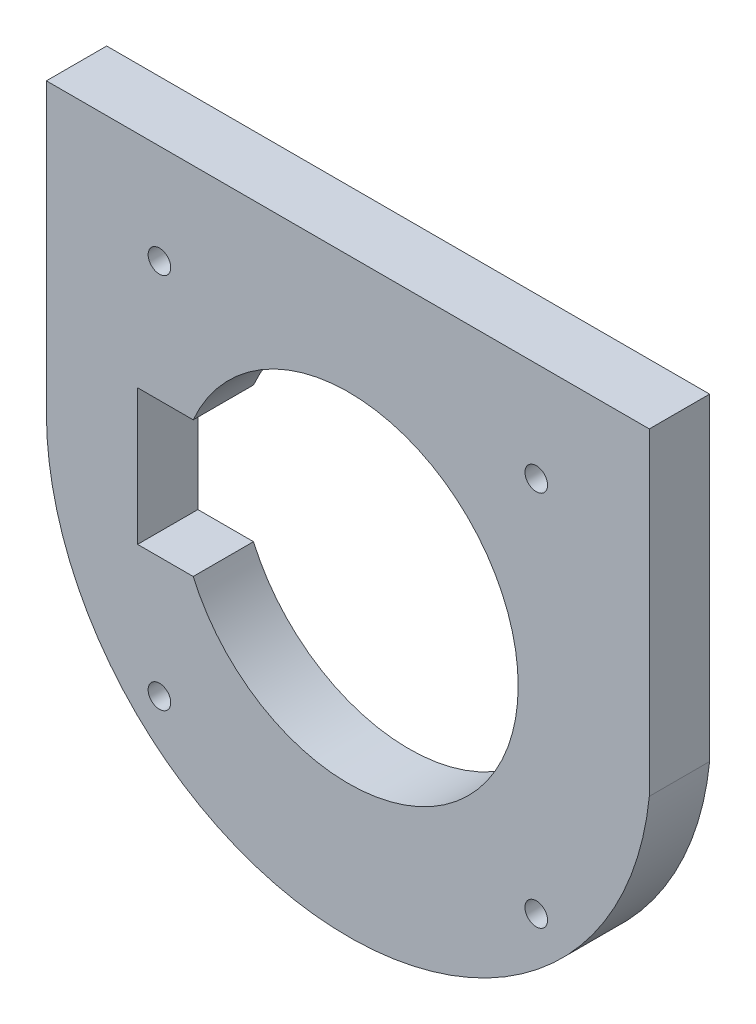
ISO-10303-21;
HEADER;
FILE_DESCRIPTION(('STEP AP214'),'2;1');
FILE_NAME('part.step','',(''),(''),'','','');
FILE_SCHEMA(('AUTOMOTIVE_DESIGN { 1 0 10303 214 1 1 1 1 }'));
ENDSEC;
DATA;
#1=APPLICATION_CONTEXT('core data for automotive mechanical design processes');
#2=APPLICATION_PROTOCOL_DEFINITION('international standard','automotive_design',2000,#1);
#3=PRODUCT_CONTEXT('',#1,'mechanical');
#4=PRODUCT('Part','Part','',(#3));
#5=PRODUCT_RELATED_PRODUCT_CATEGORY('part','',(#4));
#6=PRODUCT_DEFINITION_FORMATION('','',#4);
#7=PRODUCT_DEFINITION_CONTEXT('part definition',#1,'design');
#8=PRODUCT_DEFINITION('design','',#6,#7);
#9=PRODUCT_DEFINITION_SHAPE('','',#8);
#10=(LENGTH_UNIT() NAMED_UNIT(*) SI_UNIT(.MILLI.,.METRE.));
#11=(NAMED_UNIT(*) PLANE_ANGLE_UNIT() SI_UNIT($,.RADIAN.));
#12=(NAMED_UNIT(*) SI_UNIT($,.STERADIAN.) SOLID_ANGLE_UNIT());
#13=UNCERTAINTY_MEASURE_WITH_UNIT(LENGTH_MEASURE(1.E-05),#10,'distance_accuracy_value','');
#14=(GEOMETRIC_REPRESENTATION_CONTEXT(3) GLOBAL_UNCERTAINTY_ASSIGNED_CONTEXT((#13)) GLOBAL_UNIT_ASSIGNED_CONTEXT((#10,
#11,#12)) REPRESENTATION_CONTEXT('',''));
#15=CARTESIAN_POINT('',(0.,0.,0.));
#16=DIRECTION('',(0.,0.,1.));
#17=DIRECTION('',(1.,0.,0.));
#18=AXIS2_PLACEMENT_3D('',#15,#16,#17);
#19=CARTESIAN_POINT('',(0.,0.,0.));
#20=DIRECTION('',(0.,0.,-1.));
#21=DIRECTION('',(-1.,0.,0.));
#22=AXIS2_PLACEMENT_3D('',#19,#20,#21);
#23=PLANE('',#22);
#24=CARTESIAN_POINT('',(50.1000000000108,59.2999999999969,0.));
#25=DIRECTION('',(0.,0.,1.));
#26=DIRECTION('',(1.,0.,0.));
#27=AXIS2_PLACEMENT_3D('',#24,#25,#26);
#28=CIRCLE('',#27,22.5);
#29=CARTESIAN_POINT('',(29.4784093727096,50.2999999999969,0.));
#30=VERTEX_POINT('',#29);
#31=CARTESIAN_POINT('',(29.4784093727096,68.2999999999969,0.));
#32=VERTEX_POINT('',#31);
#33=EDGE_CURVE('E102',#30,#32,#28,.T.);
#34=ORIENTED_EDGE('',*,*,#33,.T.);
#35=DIRECTION('',(-1.,0.,0.));
#36=VECTOR('',#35,1.);
#37=CARTESIAN_POINT('',(29.4784093727096,68.2999999999969,0.));
#38=LINE('',#37,#36);
#39=CARTESIAN_POINT('',(22.1000000000108,68.2999999999969,0.));
#40=VERTEX_POINT('',#39);
#41=EDGE_CURVE('E111',#32,#40,#38,.T.);
#42=ORIENTED_EDGE('',*,*,#41,.T.);
#43=DIRECTION('',(0.,-1.,0.));
#44=VECTOR('',#43,1.);
#45=CARTESIAN_POINT('',(22.1000000000108,68.2999999999969,0.));
#46=LINE('',#45,#44);
#47=CARTESIAN_POINT('',(22.1000000000108,50.2999999999969,0.));
#48=VERTEX_POINT('',#47);
#49=EDGE_CURVE('E51',#40,#48,#46,.T.);
#50=ORIENTED_EDGE('',*,*,#49,.T.);
#51=DIRECTION('',(1.,0.,0.));
#52=VECTOR('',#51,1.);
#53=CARTESIAN_POINT('',(29.4784093727096,50.2999999999969,0.));
#54=LINE('',#53,#52);
#55=EDGE_CURVE('E108',#48,#30,#54,.T.);
#56=ORIENTED_EDGE('',*,*,#55,.T.);
#57=EDGE_LOOP('',(#34,#42,#50,#56));
#58=FACE_BOUND('',#57,.T.);
#59=CARTESIAN_POINT('',(25.0000000000108,84.299999999997,0.));
#60=DIRECTION('',(0.,0.,1.));
#61=DIRECTION('',(-1.,0.,0.));
#62=AXIS2_PLACEMENT_3D('',#59,#60,#61);
#63=CIRCLE('',#62,1.5);
#64=CARTESIAN_POINT('',(23.5000000000108,84.299999999997,0.));
#65=VERTEX_POINT('',#64);
#66=EDGE_CURVE('E136',#65,#65,#63,.T.);
#67=ORIENTED_EDGE('',*,*,#66,.T.);
#68=EDGE_LOOP('',(#67));
#69=FACE_BOUND('',#68,.T.);
#70=CARTESIAN_POINT('',(25.0000000000108,34.2999999999969,0.));
#71=DIRECTION('',(0.,0.,1.));
#72=DIRECTION('',(1.,0.,0.));
#73=AXIS2_PLACEMENT_3D('',#70,#71,#72);
#74=CIRCLE('',#73,1.5);
#75=CARTESIAN_POINT('',(26.5000000000108,34.2999999999969,0.));
#76=VERTEX_POINT('',#75);
#77=EDGE_CURVE('E142',#76,#76,#74,.T.);
#78=ORIENTED_EDGE('',*,*,#77,.T.);
#79=EDGE_LOOP('',(#78));
#80=FACE_BOUND('',#79,.T.);
#81=CARTESIAN_POINT('',(75.0000000000108,34.2999999999969,0.));
#82=DIRECTION('',(0.,0.,1.));
#83=DIRECTION('',(-1.,0.,0.));
#84=AXIS2_PLACEMENT_3D('',#81,#82,#83);
#85=CIRCLE('',#84,1.5);
#86=CARTESIAN_POINT('',(73.5000000000108,34.2999999999969,0.));
#87=VERTEX_POINT('',#86);
#88=EDGE_CURVE('E148',#87,#87,#85,.T.);
#89=ORIENTED_EDGE('',*,*,#88,.T.);
#90=EDGE_LOOP('',(#89));
#91=FACE_BOUND('',#90,.T.);
#92=CARTESIAN_POINT('',(75.0000000000108,84.299999999997,0.));
#93=DIRECTION('',(0.,0.,1.));
#94=DIRECTION('',(1.,0.,0.));
#95=AXIS2_PLACEMENT_3D('',#92,#93,#94);
#96=CIRCLE('',#95,1.5);
#97=CARTESIAN_POINT('',(76.5000000000108,84.299999999997,0.));
#98=VERTEX_POINT('',#97);
#99=EDGE_CURVE('E154',#98,#98,#96,.T.);
#100=ORIENTED_EDGE('',*,*,#99,.T.);
#101=EDGE_LOOP('',(#100));
#102=FACE_BOUND('',#101,.T.);
#103=DIRECTION('',(0.,-1.,0.));
#104=VECTOR('',#103,1.);
#105=CARTESIAN_POINT('',(10.0000000000108,59.2999999999969,0.));
#106=LINE('',#105,#104);
#107=CARTESIAN_POINT('',(10.0000000000108,97.5175721394297,0.));
#108=VERTEX_POINT('',#107);
#109=CARTESIAN_POINT('',(10.0000000000108,59.299999999997,0.));
#110=VERTEX_POINT('',#109);
#111=EDGE_CURVE('E162',#108,#110,#106,.T.);
#112=ORIENTED_EDGE('',*,*,#111,.F.);
#113=DIRECTION('',(-1.,0.,0.));
#114=VECTOR('',#113,1.);
#115=CARTESIAN_POINT('',(10.0000000000108,97.5175721394297,0.));
#116=LINE('',#115,#114);
#117=CARTESIAN_POINT('',(90.0000000000108,97.5175721394297,0.));
#118=VERTEX_POINT('',#117);
#119=EDGE_CURVE('E160',#118,#108,#116,.T.);
#120=ORIENTED_EDGE('',*,*,#119,.F.);
#121=DIRECTION('',(0.,1.,0.));
#122=VECTOR('',#121,1.);
#123=CARTESIAN_POINT('',(90.0000000000108,97.5175721394297,0.));
#124=LINE('',#123,#122);
#125=CARTESIAN_POINT('',(90.0000000000108,55.2999999999969,0.));
#126=VERTEX_POINT('',#125);
#127=EDGE_CURVE('E169',#126,#118,#124,.T.);
#128=ORIENTED_EDGE('',*,*,#127,.F.);
#129=CARTESIAN_POINT('',(50.1000000000108,59.2999999999969,0.));
#130=DIRECTION('',(0.,0.,1.));
#131=DIRECTION('',(1.,0.,0.));
#132=AXIS2_PLACEMENT_3D('',#129,#130,#131);
#133=CIRCLE('',#132,40.1);
#134=EDGE_CURVE('E166',#110,#126,#133,.T.);
#135=ORIENTED_EDGE('',*,*,#134,.F.);
#136=EDGE_LOOP('',(#112,#120,#128,#135));
#137=FACE_BOUND('',#136,.T.);
#138=ADVANCED_FACE('F35',(#58,#69,#80,#91,#102,#137),#23,.T.);
#139=CARTESIAN_POINT('',(10.0000000000108,97.5175721394297,0.));
#140=DIRECTION('',(0.,1.,0.));
#141=DIRECTION('',(-1.,0.,0.));
#142=AXIS2_PLACEMENT_3D('',#139,#140,#141);
#143=PLANE('',#142);
#144=DIRECTION('',(-1.,0.,0.));
#145=VECTOR('',#144,1.);
#146=CARTESIAN_POINT('',(10.0000000000108,97.5175721394297,8.));
#147=LINE('',#146,#145);
#148=CARTESIAN_POINT('',(90.0000000000108,97.5175721394297,8.));
#149=VERTEX_POINT('',#148);
#150=CARTESIAN_POINT('',(10.0000000000108,97.5175721394297,8.));
#151=VERTEX_POINT('',#150);
#152=EDGE_CURVE('E157',#149,#151,#147,.T.);
#153=ORIENTED_EDGE('',*,*,#152,.F.);
#154=DIRECTION('',(0.,0.,1.));
#155=VECTOR('',#154,1.);
#156=CARTESIAN_POINT('',(90.0000000000108,97.5175721394297,0.));
#157=LINE('',#156,#155);
#158=EDGE_CURVE('E12',#118,#149,#157,.T.);
#159=ORIENTED_EDGE('',*,*,#158,.F.);
#160=ORIENTED_EDGE('',*,*,#119,.T.);
#161=DIRECTION('',(0.,0.,1.));
#162=VECTOR('',#161,1.);
#163=CARTESIAN_POINT('',(10.0000000000108,97.5175721394297,0.));
#164=LINE('',#163,#162);
#165=EDGE_CURVE('E38',#108,#151,#164,.T.);
#166=ORIENTED_EDGE('',*,*,#165,.T.);
#167=EDGE_LOOP('',(#153,#159,#160,#166));
#168=FACE_BOUND('',#167,.T.);
#169=ADVANCED_FACE('F189',(#168),#143,.T.);
#170=CARTESIAN_POINT('',(90.0000000000108,97.5175721394297,0.));
#171=DIRECTION('',(1.,0.,0.));
#172=DIRECTION('',(0.,0.,-1.));
#173=AXIS2_PLACEMENT_3D('',#170,#171,#172);
#174=PLANE('',#173);
#175=DIRECTION('',(0.,1.,0.));
#176=VECTOR('',#175,1.);
#177=CARTESIAN_POINT('',(90.0000000000108,97.5175721394297,8.));
#178=LINE('',#177,#176);
#179=CARTESIAN_POINT('',(90.0000000000108,55.2999999999969,8.));
#180=VERTEX_POINT('',#179);
#181=EDGE_CURVE('E163',#180,#149,#178,.T.);
#182=ORIENTED_EDGE('',*,*,#181,.F.);
#183=DIRECTION('',(0.,0.,1.));
#184=VECTOR('',#183,1.);
#185=CARTESIAN_POINT('',(90.0000000000108,55.2999999999969,0.));
#186=LINE('',#185,#184);
#187=EDGE_CURVE('E43',#126,#180,#186,.T.);
#188=ORIENTED_EDGE('',*,*,#187,.F.);
#189=ORIENTED_EDGE('',*,*,#127,.T.);
#190=ORIENTED_EDGE('',*,*,#158,.T.);
#191=EDGE_LOOP('',(#182,#188,#189,#190));
#192=FACE_BOUND('',#191,.T.);
#193=ADVANCED_FACE('F197',(#192),#174,.T.);
#194=CARTESIAN_POINT('',(50.1000000000108,59.2999999999969,0.));
#195=DIRECTION('',(0.,0.,1.));
#196=DIRECTION('',(1.,0.,0.));
#197=AXIS2_PLACEMENT_3D('',#194,#195,#196);
#198=CYLINDRICAL_SURFACE('',#197,40.1);
#199=CARTESIAN_POINT('',(50.1000000000108,59.2999999999969,8.));
#200=DIRECTION('',(0.,0.,1.));
#201=DIRECTION('',(1.,0.,0.));
#202=AXIS2_PLACEMENT_3D('',#199,#200,#201);
#203=CIRCLE('',#202,40.1);
#204=CARTESIAN_POINT('',(10.0000000000108,59.299999999997,8.));
#205=VERTEX_POINT('',#204);
#206=EDGE_CURVE('E177',#205,#180,#203,.T.);
#207=ORIENTED_EDGE('',*,*,#206,.F.);
#208=DIRECTION('',(0.,0.,1.));
#209=VECTOR('',#208,1.);
#210=CARTESIAN_POINT('',(10.0000000000108,59.299999999997,0.));
#211=LINE('',#210,#209);
#212=EDGE_CURVE('E182',#110,#205,#211,.T.);
#213=ORIENTED_EDGE('',*,*,#212,.F.);
#214=ORIENTED_EDGE('',*,*,#134,.T.);
#215=ORIENTED_EDGE('',*,*,#187,.T.);
#216=EDGE_LOOP('',(#207,#213,#214,#215));
#217=FACE_BOUND('',#216,.T.);
#218=ADVANCED_FACE('F202',(#217),#198,.T.);
#219=CARTESIAN_POINT('',(10.0000000000108,59.2999999999969,0.));
#220=DIRECTION('',(-1.,0.,0.));
#221=DIRECTION('',(0.,-1.,0.));
#222=AXIS2_PLACEMENT_3D('',#219,#220,#221);
#223=PLANE('',#222);
#224=DIRECTION('',(0.,-1.,0.));
#225=VECTOR('',#224,1.);
#226=CARTESIAN_POINT('',(10.0000000000108,59.2999999999969,8.));
#227=LINE('',#226,#225);
#228=EDGE_CURVE('E174',#151,#205,#227,.T.);
#229=ORIENTED_EDGE('',*,*,#228,.F.);
#230=ORIENTED_EDGE('',*,*,#165,.F.);
#231=ORIENTED_EDGE('',*,*,#111,.T.);
#232=ORIENTED_EDGE('',*,*,#212,.T.);
#233=EDGE_LOOP('',(#229,#230,#231,#232));
#234=FACE_BOUND('',#233,.T.);
#235=ADVANCED_FACE('F192',(#234),#223,.T.);
#236=CARTESIAN_POINT('',(0.,0.,8.));
#237=DIRECTION('',(0.,0.,-1.));
#238=DIRECTION('',(-1.,0.,0.));
#239=AXIS2_PLACEMENT_3D('',#236,#237,#238);
#240=PLANE('',#239);
#241=DIRECTION('',(-1.,0.,0.));
#242=VECTOR('',#241,1.);
#243=CARTESIAN_POINT('',(29.4784093727096,68.2999999999969,8.));
#244=LINE('',#243,#242);
#245=CARTESIAN_POINT('',(29.4784093727096,68.2999999999969,8.));
#246=VERTEX_POINT('',#245);
#247=CARTESIAN_POINT('',(22.1000000000108,68.2999999999969,8.));
#248=VERTEX_POINT('',#247);
#249=EDGE_CURVE('E126',#246,#248,#244,.T.);
#250=ORIENTED_EDGE('',*,*,#249,.F.);
#251=CARTESIAN_POINT('',(50.1000000000108,59.2999999999969,8.));
#252=DIRECTION('',(0.,0.,1.));
#253=DIRECTION('',(1.,0.,0.));
#254=AXIS2_PLACEMENT_3D('',#251,#252,#253);
#255=CIRCLE('',#254,22.5);
#256=CARTESIAN_POINT('',(29.4784093727096,50.2999999999969,8.));
#257=VERTEX_POINT('',#256);
#258=EDGE_CURVE('E59',#257,#246,#255,.T.);
#259=ORIENTED_EDGE('',*,*,#258,.F.);
#260=DIRECTION('',(1.,0.,0.));
#261=VECTOR('',#260,1.);
#262=CARTESIAN_POINT('',(29.4784093727096,50.2999999999969,8.));
#263=LINE('',#262,#261);
#264=CARTESIAN_POINT('',(22.1000000000108,50.2999999999969,8.));
#265=VERTEX_POINT('',#264);
#266=EDGE_CURVE('E117',#265,#257,#263,.T.);
#267=ORIENTED_EDGE('',*,*,#266,.F.);
#268=DIRECTION('',(0.,-1.,0.));
#269=VECTOR('',#268,1.);
#270=CARTESIAN_POINT('',(22.1000000000108,68.2999999999969,8.));
#271=LINE('',#270,#269);
#272=EDGE_CURVE('E120',#248,#265,#271,.T.);
#273=ORIENTED_EDGE('',*,*,#272,.F.);
#274=EDGE_LOOP('',(#250,#259,#267,#273));
#275=FACE_BOUND('',#274,.T.);
#276=CARTESIAN_POINT('',(25.0000000000108,84.299999999997,8.));
#277=DIRECTION('',(0.,0.,1.));
#278=DIRECTION('',(-1.,0.,0.));
#279=AXIS2_PLACEMENT_3D('',#276,#277,#278);
#280=CIRCLE('',#279,1.5);
#281=CARTESIAN_POINT('',(23.5000000000108,84.299999999997,8.));
#282=VERTEX_POINT('',#281);
#283=EDGE_CURVE('E132',#282,#282,#280,.T.);
#284=ORIENTED_EDGE('',*,*,#283,.F.);
#285=EDGE_LOOP('',(#284));
#286=FACE_BOUND('',#285,.T.);
#287=CARTESIAN_POINT('',(25.0000000000108,34.2999999999969,8.));
#288=DIRECTION('',(0.,0.,1.));
#289=DIRECTION('',(1.,0.,0.));
#290=AXIS2_PLACEMENT_3D('',#287,#288,#289);
#291=CIRCLE('',#290,1.5);
#292=CARTESIAN_POINT('',(26.5000000000108,34.2999999999969,8.));
#293=VERTEX_POINT('',#292);
#294=EDGE_CURVE('E139',#293,#293,#291,.T.);
#295=ORIENTED_EDGE('',*,*,#294,.F.);
#296=EDGE_LOOP('',(#295));
#297=FACE_BOUND('',#296,.T.);
#298=CARTESIAN_POINT('',(75.0000000000108,34.2999999999969,8.));
#299=DIRECTION('',(0.,0.,1.));
#300=DIRECTION('',(-1.,0.,0.));
#301=AXIS2_PLACEMENT_3D('',#298,#299,#300);
#302=CIRCLE('',#301,1.5);
#303=CARTESIAN_POINT('',(73.5000000000108,34.2999999999969,8.));
#304=VERTEX_POINT('',#303);
#305=EDGE_CURVE('E145',#304,#304,#302,.T.);
#306=ORIENTED_EDGE('',*,*,#305,.F.);
#307=EDGE_LOOP('',(#306));
#308=FACE_BOUND('',#307,.T.);
#309=CARTESIAN_POINT('',(75.0000000000108,84.299999999997,8.));
#310=DIRECTION('',(0.,0.,1.));
#311=DIRECTION('',(1.,0.,0.));
#312=AXIS2_PLACEMENT_3D('',#309,#310,#311);
#313=CIRCLE('',#312,1.5);
#314=CARTESIAN_POINT('',(76.5000000000108,84.299999999997,8.));
#315=VERTEX_POINT('',#314);
#316=EDGE_CURVE('E151',#315,#315,#313,.T.);
#317=ORIENTED_EDGE('',*,*,#316,.F.);
#318=EDGE_LOOP('',(#317));
#319=FACE_BOUND('',#318,.T.);
#320=ORIENTED_EDGE('',*,*,#152,.T.);
#321=ORIENTED_EDGE('',*,*,#228,.T.);
#322=ORIENTED_EDGE('',*,*,#206,.T.);
#323=ORIENTED_EDGE('',*,*,#181,.T.);
#324=EDGE_LOOP('',(#320,#321,#322,#323));
#325=FACE_BOUND('',#324,.T.);
#326=ADVANCED_FACE('F194',(#275,#286,#297,#308,#319,#325),#240,.F.);
#327=CARTESIAN_POINT('',(75.0000000000108,84.299999999997,0.));
#328=DIRECTION('',(0.,0.,1.));
#329=DIRECTION('',(1.,0.,0.));
#330=AXIS2_PLACEMENT_3D('',#327,#328,#329);
#331=CYLINDRICAL_SURFACE('',#330,1.5);
#332=ORIENTED_EDGE('',*,*,#99,.F.);
#333=EDGE_LOOP('',(#332));
#334=FACE_BOUND('',#333,.T.);
#335=ORIENTED_EDGE('',*,*,#316,.T.);
#336=EDGE_LOOP('',(#335));
#337=FACE_BOUND('',#336,.T.);
#338=ADVANCED_FACE('F219',(#334,#337),#331,.F.);
#339=CARTESIAN_POINT('',(75.0000000000108,34.2999999999969,0.));
#340=DIRECTION('',(0.,0.,1.));
#341=DIRECTION('',(1.,0.,0.));
#342=AXIS2_PLACEMENT_3D('',#339,#340,#341);
#343=CYLINDRICAL_SURFACE('',#342,1.5);
#344=ORIENTED_EDGE('',*,*,#88,.F.);
#345=EDGE_LOOP('',(#344));
#346=FACE_BOUND('',#345,.T.);
#347=ORIENTED_EDGE('',*,*,#305,.T.);
#348=EDGE_LOOP('',(#347));
#349=FACE_BOUND('',#348,.T.);
#350=ADVANCED_FACE('F224',(#346,#349),#343,.F.);
#351=CARTESIAN_POINT('',(25.0000000000108,34.2999999999969,0.));
#352=DIRECTION('',(0.,0.,1.));
#353=DIRECTION('',(1.,0.,0.));
#354=AXIS2_PLACEMENT_3D('',#351,#352,#353);
#355=CYLINDRICAL_SURFACE('',#354,1.5);
#356=ORIENTED_EDGE('',*,*,#77,.F.);
#357=EDGE_LOOP('',(#356));
#358=FACE_BOUND('',#357,.T.);
#359=ORIENTED_EDGE('',*,*,#294,.T.);
#360=EDGE_LOOP('',(#359));
#361=FACE_BOUND('',#360,.T.);
#362=ADVANCED_FACE('F239',(#358,#361),#355,.F.);
#363=CARTESIAN_POINT('',(25.0000000000108,84.299999999997,0.));
#364=DIRECTION('',(0.,0.,1.));
#365=DIRECTION('',(1.,0.,0.));
#366=AXIS2_PLACEMENT_3D('',#363,#364,#365);
#367=CYLINDRICAL_SURFACE('',#366,1.5);
#368=ORIENTED_EDGE('',*,*,#66,.F.);
#369=EDGE_LOOP('',(#368));
#370=FACE_BOUND('',#369,.T.);
#371=ORIENTED_EDGE('',*,*,#283,.T.);
#372=EDGE_LOOP('',(#371));
#373=FACE_BOUND('',#372,.T.);
#374=ADVANCED_FACE('F245',(#370,#373),#367,.F.);
#375=CARTESIAN_POINT('',(50.1000000000108,59.2999999999969,0.));
#376=DIRECTION('',(0.,0.,1.));
#377=DIRECTION('',(1.,0.,0.));
#378=AXIS2_PLACEMENT_3D('',#375,#376,#377);
#379=CYLINDRICAL_SURFACE('',#378,22.5);
#380=ORIENTED_EDGE('',*,*,#258,.T.);
#381=DIRECTION('',(0.,0.,1.));
#382=VECTOR('',#381,1.);
#383=CARTESIAN_POINT('',(29.4784093727096,68.2999999999969,0.));
#384=LINE('',#383,#382);
#385=EDGE_CURVE('E98',#32,#246,#384,.T.);
#386=ORIENTED_EDGE('',*,*,#385,.F.);
#387=ORIENTED_EDGE('',*,*,#33,.F.);
#388=DIRECTION('',(0.,0.,1.));
#389=VECTOR('',#388,1.);
#390=CARTESIAN_POINT('',(29.4784093727096,50.2999999999969,0.));
#391=LINE('',#390,#389);
#392=EDGE_CURVE('E130',#30,#257,#391,.T.);
#393=ORIENTED_EDGE('',*,*,#392,.T.);
#394=EDGE_LOOP('',(#380,#386,#387,#393));
#395=FACE_BOUND('',#394,.T.);
#396=ADVANCED_FACE('F100',(#395),#379,.F.);
#397=CARTESIAN_POINT('',(29.4784093727096,50.2999999999969,0.));
#398=DIRECTION('',(0.,-1.,0.));
#399=DIRECTION('',(1.,0.,0.));
#400=AXIS2_PLACEMENT_3D('',#397,#398,#399);
#401=PLANE('',#400);
#402=ORIENTED_EDGE('',*,*,#266,.T.);
#403=ORIENTED_EDGE('',*,*,#392,.F.);
#404=ORIENTED_EDGE('',*,*,#55,.F.);
#405=DIRECTION('',(0.,0.,1.));
#406=VECTOR('',#405,1.);
#407=CARTESIAN_POINT('',(22.1000000000108,50.2999999999969,0.));
#408=LINE('',#407,#406);
#409=EDGE_CURVE('E133',#48,#265,#408,.T.);
#410=ORIENTED_EDGE('',*,*,#409,.T.);
#411=EDGE_LOOP('',(#402,#403,#404,#410));
#412=FACE_BOUND('',#411,.T.);
#413=ADVANCED_FACE('F255',(#412),#401,.F.);
#414=CARTESIAN_POINT('',(22.1000000000108,68.2999999999969,0.));
#415=DIRECTION('',(-1.,0.,0.));
#416=DIRECTION('',(0.,-1.,0.));
#417=AXIS2_PLACEMENT_3D('',#414,#415,#416);
#418=PLANE('',#417);
#419=ORIENTED_EDGE('',*,*,#272,.T.);
#420=ORIENTED_EDGE('',*,*,#409,.F.);
#421=ORIENTED_EDGE('',*,*,#49,.F.);
#422=DIRECTION('',(0.,0.,1.));
#423=VECTOR('',#422,1.);
#424=CARTESIAN_POINT('',(22.1000000000108,68.2999999999969,0.));
#425=LINE('',#424,#423);
#426=EDGE_CURVE('E107',#40,#248,#425,.T.);
#427=ORIENTED_EDGE('',*,*,#426,.T.);
#428=EDGE_LOOP('',(#419,#420,#421,#427));
#429=FACE_BOUND('',#428,.T.);
#430=ADVANCED_FACE('F258',(#429),#418,.F.);
#431=CARTESIAN_POINT('',(29.4784093727096,68.2999999999969,0.));
#432=DIRECTION('',(0.,1.,0.));
#433=DIRECTION('',(0.,0.,1.));
#434=AXIS2_PLACEMENT_3D('',#431,#432,#433);
#435=PLANE('',#434);
#436=ORIENTED_EDGE('',*,*,#249,.T.);
#437=ORIENTED_EDGE('',*,*,#426,.F.);
#438=ORIENTED_EDGE('',*,*,#41,.F.);
#439=ORIENTED_EDGE('',*,*,#385,.T.);
#440=EDGE_LOOP('',(#436,#437,#438,#439));
#441=FACE_BOUND('',#440,.T.);
#442=ADVANCED_FACE('F112',(#441),#435,.F.);
#443=CLOSED_SHELL('',(#138,#169,#193,#218,#235,#326,#338,#350,#362,#374,#396,#413,#430,#442));
#444=MANIFOLD_SOLID_BREP('B2',#443);
#445=ADVANCED_BREP_SHAPE_REPRESENTATION('',(#18,#444),#14);
#446=SHAPE_DEFINITION_REPRESENTATION(#9,#445);
ENDSEC;
END-ISO-10303-21;
